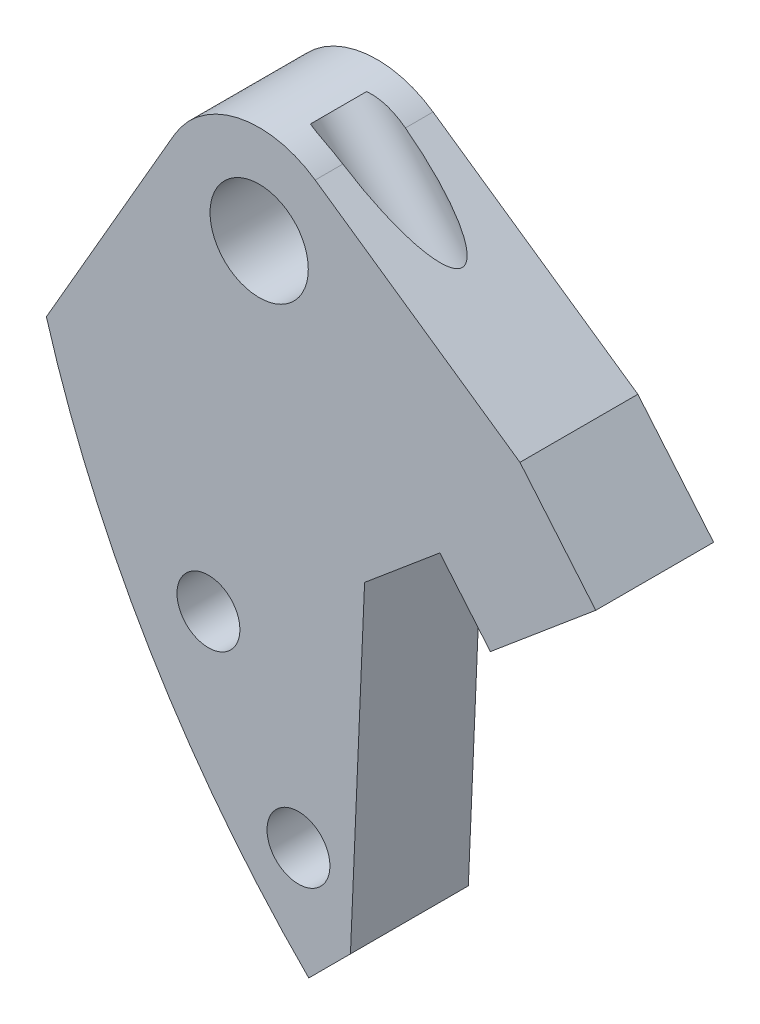
ISO-10303-21;
HEADER;
FILE_DESCRIPTION(('STEP AP214'),'2;1');
FILE_NAME('part.step','',(''),(''),'','','');
FILE_SCHEMA(('AUTOMOTIVE_DESIGN { 1 0 10303 214 1 1 1 1 }'));
ENDSEC;
DATA;
#1=APPLICATION_CONTEXT('core data for automotive mechanical design processes');
#2=APPLICATION_PROTOCOL_DEFINITION('international standard','automotive_design',2000,#1);
#3=PRODUCT_CONTEXT('',#1,'mechanical');
#4=PRODUCT('Part','Part','',(#3));
#5=PRODUCT_RELATED_PRODUCT_CATEGORY('part','',(#4));
#6=PRODUCT_DEFINITION_FORMATION('','',#4);
#7=PRODUCT_DEFINITION_CONTEXT('part definition',#1,'design');
#8=PRODUCT_DEFINITION('design','',#6,#7);
#9=PRODUCT_DEFINITION_SHAPE('','',#8);
#10=(LENGTH_UNIT() NAMED_UNIT(*) SI_UNIT(.MILLI.,.METRE.));
#11=(NAMED_UNIT(*) PLANE_ANGLE_UNIT() SI_UNIT($,.RADIAN.));
#12=(NAMED_UNIT(*) SI_UNIT($,.STERADIAN.) SOLID_ANGLE_UNIT());
#13=UNCERTAINTY_MEASURE_WITH_UNIT(LENGTH_MEASURE(1.E-05),#10,'distance_accuracy_value','');
#14=(GEOMETRIC_REPRESENTATION_CONTEXT(3) GLOBAL_UNCERTAINTY_ASSIGNED_CONTEXT((#13)) GLOBAL_UNIT_ASSIGNED_CONTEXT((#10,
#11,#12)) REPRESENTATION_CONTEXT('',''));
#15=CARTESIAN_POINT('',(0.,0.,0.));
#16=DIRECTION('',(0.,0.,1.));
#17=DIRECTION('',(1.,0.,0.));
#18=AXIS2_PLACEMENT_3D('',#15,#16,#17);
#19=CARTESIAN_POINT('',(7.91033905045424E-13,3.60822483003176E-13,6.));
#20=DIRECTION('',(0.,0.,-1.));
#21=DIRECTION('',(-1.,0.,0.));
#22=AXIS2_PLACEMENT_3D('',#19,#20,#21);
#23=PLANE('',#22);
#24=CARTESIAN_POINT('',(-42.5827835817611,-23.873668727191,6.));
#25=DIRECTION('',(0.,0.,-1.));
#26=DIRECTION('',(-1.,0.,0.));
#27=AXIS2_PLACEMENT_3D('',#24,#25,#26);
#28=CIRCLE('',#27,1.6);
#29=CARTESIAN_POINT('',(-44.1827835817612,-23.873668727191,6.));
#30=VERTEX_POINT('',#29);
#31=EDGE_CURVE('E306',#30,#30,#28,.T.);
#32=ORIENTED_EDGE('',*,*,#31,.T.);
#33=EDGE_LOOP('',(#32));
#34=FACE_BOUND('',#33,.T.);
#35=CARTESIAN_POINT('',(-38.,-32.,6.));
#36=DIRECTION('',(0.,0.,-1.));
#37=DIRECTION('',(-1.,0.,0.));
#38=AXIS2_PLACEMENT_3D('',#35,#36,#37);
#39=CIRCLE('',#38,1.6);
#40=CARTESIAN_POINT('',(-39.6,-32.,6.));
#41=VERTEX_POINT('',#40);
#42=EDGE_CURVE('E311',#41,#41,#39,.T.);
#43=ORIENTED_EDGE('',*,*,#42,.T.);
#44=EDGE_LOOP('',(#43));
#45=FACE_BOUND('',#44,.T.);
#46=CARTESIAN_POINT('',(7.91033905045424E-13,3.60822483003176E-13,6.));
#47=DIRECTION('',(0.,0.,1.));
#48=DIRECTION('',(-1.,0.,0.));
#49=AXIS2_PLACEMENT_3D('',#46,#47,#48);
#50=CIRCLE('',#49,53.0000000000019);
#51=CARTESIAN_POINT('',(-50.8304407825298,-15.0088737037077,6.));
#52=VERTEX_POINT('',#51);
#53=CARTESIAN_POINT('',(-37.4766594028879,-37.4766594028876,6.));
#54=VERTEX_POINT('',#53);
#55=EDGE_CURVE('E185',#52,#54,#50,.T.);
#56=ORIENTED_EDGE('',*,*,#55,.T.);
#57=DIRECTION('',(0.70710678118655,0.707106781186545,0.));
#58=VECTOR('',#57,1.);
#59=CARTESIAN_POINT('',(-37.4766594028879,-37.4766594028876,6.));
#60=LINE('',#59,#58);
#61=CARTESIAN_POINT('',(-35.3553390593275,-35.3553390593272,6.));
#62=VERTEX_POINT('',#61);
#63=EDGE_CURVE('E111',#54,#62,#60,.T.);
#64=ORIENTED_EDGE('',*,*,#63,.T.);
#65=DIRECTION('',(0.0429998145843386,0.99907508023457,0.));
#66=VECTOR('',#65,1.);
#67=CARTESIAN_POINT('',(-35.3553390593275,-35.3553390593272,6.));
#68=LINE('',#67,#66);
#69=CARTESIAN_POINT('',(-34.6350119375725,-18.6189674279805,6.));
#70=VERTEX_POINT('',#69);
#71=EDGE_CURVE('E283',#62,#70,#68,.T.);
#72=ORIENTED_EDGE('',*,*,#71,.T.);
#73=DIRECTION('',(0.766044443118976,0.642787609686541,0.));
#74=VECTOR('',#73,1.);
#75=CARTESIAN_POINT('',(-30.8047897219776,-15.4050293795478,6.));
#76=LINE('',#75,#74);
#77=CARTESIAN_POINT('',(-30.8047897219776,-15.4050293795478,6.));
#78=VERTEX_POINT('',#77);
#79=EDGE_CURVE('E295',#70,#78,#76,.T.);
#80=ORIENTED_EDGE('',*,*,#79,.T.);
#81=DIRECTION('',(0.642787609686543,-0.766044443118975,0.));
#82=VECTOR('',#81,1.);
#83=CARTESIAN_POINT('',(-28.2336392832319,-18.4692071520232,6.));
#84=LINE('',#83,#82);
#85=CARTESIAN_POINT('',(-28.2336392832319,-18.4692071520232,6.));
#86=VERTEX_POINT('',#85);
#87=EDGE_CURVE('E292',#78,#86,#84,.T.);
#88=ORIENTED_EDGE('',*,*,#87,.T.);
#89=DIRECTION('',(0.766044443118977,0.642787609686541,0.));
#90=VECTOR('',#89,1.);
#91=CARTESIAN_POINT('',(-22.871328181399,-13.9696938842174,6.));
#92=LINE('',#91,#90);
#93=CARTESIAN_POINT('',(-22.871328181399,-13.9696938842174,6.));
#94=VERTEX_POINT('',#93);
#95=EDGE_CURVE('E294',#86,#94,#92,.T.);
#96=ORIENTED_EDGE('',*,*,#95,.T.);
#97=DIRECTION('',(-0.642787609686539,0.766044443118978,0.));
#98=VECTOR('',#97,1.);
#99=CARTESIAN_POINT('',(-25.4424786201448,-10.905516111742,6.));
#100=LINE('',#99,#98);
#101=CARTESIAN_POINT('',(-26.7280538395179,-9.37342722550405,6.));
#102=VERTEX_POINT('',#101);
#103=EDGE_CURVE('E139',#94,#102,#100,.T.);
#104=ORIENTED_EDGE('',*,*,#103,.T.);
#105=DIRECTION('',(-0.821584560089023,0.570086669396266,0.));
#106=VECTOR('',#105,1.);
#107=CARTESIAN_POINT('',(-26.7280538395179,-9.37342722550405,6.));
#108=LINE('',#107,#106);
#109=CARTESIAN_POINT('',(-37.1495666530187,-2.14207719955489,6.));
#110=VERTEX_POINT('',#109);
#111=EDGE_CURVE('E132',#102,#110,#108,.T.);
#112=ORIENTED_EDGE('',*,*,#111,.T.);
#113=CARTESIAN_POINT('',(-40.,-6.25000000000001,6.));
#114=DIRECTION('',(0.,0.,1.));
#115=DIRECTION('',(1.,0.,0.));
#116=AXIS2_PLACEMENT_3D('',#113,#114,#115);
#117=CIRCLE('',#116,5.);
#118=CARTESIAN_POINT('',(-44.3301270189222,-3.75000000000002,6.));
#119=VERTEX_POINT('',#118);
#120=EDGE_CURVE('E136',#110,#119,#117,.T.);
#121=ORIENTED_EDGE('',*,*,#120,.T.);
#122=DIRECTION('',(-0.499999999999998,-0.86602540378444,0.));
#123=VECTOR('',#122,1.);
#124=CARTESIAN_POINT('',(-44.3301270189222,-3.75000000000002,6.));
#125=LINE('',#124,#123);
#126=EDGE_CURVE('E63',#119,#52,#125,.T.);
#127=ORIENTED_EDGE('',*,*,#126,.T.);
#128=EDGE_LOOP('',(#56,#64,#72,#80,#88,#96,#104,#112,#121,#127));
#129=FACE_BOUND('',#128,.T.);
#130=CARTESIAN_POINT('',(-40.,-6.25000000000001,6.));
#131=DIRECTION('',(0.,0.,1.));
#132=DIRECTION('',(1.,0.,0.));
#133=AXIS2_PLACEMENT_3D('',#130,#131,#132);
#134=CIRCLE('',#133,2.5);
#135=CARTESIAN_POINT('',(-37.5,-6.25000000000001,6.));
#136=VERTEX_POINT('',#135);
#137=EDGE_CURVE('E166',#136,#136,#134,.T.);
#138=ORIENTED_EDGE('',*,*,#137,.F.);
#139=EDGE_LOOP('',(#138));
#140=FACE_BOUND('',#139,.T.);
#141=ADVANCED_FACE('F34',(#34,#45,#129,#140),#23,.F.);
#142=CARTESIAN_POINT('',(7.91033905045424E-13,3.60822483003176E-13,0.));
#143=DIRECTION('',(0.,0.,-1.));
#144=DIRECTION('',(-1.,0.,0.));
#145=AXIS2_PLACEMENT_3D('',#142,#143,#144);
#146=PLANE('',#145);
#147=CARTESIAN_POINT('',(-42.5827835817611,-23.873668727191,0.));
#148=DIRECTION('',(0.,0.,-1.));
#149=DIRECTION('',(-1.,0.,0.));
#150=AXIS2_PLACEMENT_3D('',#147,#148,#149);
#151=CIRCLE('',#150,1.6);
#152=CARTESIAN_POINT('',(-44.1827835817612,-23.873668727191,0.));
#153=VERTEX_POINT('',#152);
#154=EDGE_CURVE('E314',#153,#153,#151,.T.);
#155=ORIENTED_EDGE('',*,*,#154,.F.);
#156=EDGE_LOOP('',(#155));
#157=FACE_BOUND('',#156,.T.);
#158=CARTESIAN_POINT('',(-38.,-32.,0.));
#159=DIRECTION('',(0.,0.,-1.));
#160=DIRECTION('',(-1.,0.,0.));
#161=AXIS2_PLACEMENT_3D('',#158,#159,#160);
#162=CIRCLE('',#161,1.6);
#163=CARTESIAN_POINT('',(-39.6,-32.,0.));
#164=VERTEX_POINT('',#163);
#165=EDGE_CURVE('E315',#164,#164,#162,.T.);
#166=ORIENTED_EDGE('',*,*,#165,.F.);
#167=EDGE_LOOP('',(#166));
#168=FACE_BOUND('',#167,.T.);
#169=CARTESIAN_POINT('',(7.91033905045424E-13,3.60822483003176E-13,0.));
#170=DIRECTION('',(0.,0.,1.));
#171=DIRECTION('',(-1.,0.,0.));
#172=AXIS2_PLACEMENT_3D('',#169,#170,#171);
#173=CIRCLE('',#172,53.0000000000019);
#174=CARTESIAN_POINT('',(-50.8304407825298,-15.0088737037077,0.));
#175=VERTEX_POINT('',#174);
#176=CARTESIAN_POINT('',(-37.4766594028879,-37.4766594028876,0.));
#177=VERTEX_POINT('',#176);
#178=EDGE_CURVE('E162',#175,#177,#173,.T.);
#179=ORIENTED_EDGE('',*,*,#178,.F.);
#180=DIRECTION('',(-0.499999999999998,-0.86602540378444,0.));
#181=VECTOR('',#180,1.);
#182=CARTESIAN_POINT('',(-44.3301270189222,-3.75000000000002,0.));
#183=LINE('',#182,#181);
#184=CARTESIAN_POINT('',(-44.3301270189222,-3.75000000000002,0.));
#185=VERTEX_POINT('',#184);
#186=EDGE_CURVE('E102',#185,#175,#183,.T.);
#187=ORIENTED_EDGE('',*,*,#186,.F.);
#188=CARTESIAN_POINT('',(-40.,-6.25000000000001,0.));
#189=DIRECTION('',(0.,0.,1.));
#190=DIRECTION('',(1.,0.,0.));
#191=AXIS2_PLACEMENT_3D('',#188,#189,#190);
#192=CIRCLE('',#191,5.);
#193=CARTESIAN_POINT('',(-37.1495666530187,-2.14207719955489,0.));
#194=VERTEX_POINT('',#193);
#195=EDGE_CURVE('E182',#194,#185,#192,.T.);
#196=ORIENTED_EDGE('',*,*,#195,.F.);
#197=DIRECTION('',(-0.821584560089023,0.570086669396266,0.));
#198=VECTOR('',#197,1.);
#199=CARTESIAN_POINT('',(-26.7280538395179,-9.37342722550405,0.));
#200=LINE('',#199,#198);
#201=CARTESIAN_POINT('',(-26.7280538395179,-9.37342722550405,0.));
#202=VERTEX_POINT('',#201);
#203=EDGE_CURVE('E179',#202,#194,#200,.T.);
#204=ORIENTED_EDGE('',*,*,#203,.F.);
#205=DIRECTION('',(-0.642787609686544,0.766044443118974,0.));
#206=VECTOR('',#205,1.);
#207=CARTESIAN_POINT('',(-25.4424786201448,-10.905516111742,0.));
#208=LINE('',#207,#206);
#209=CARTESIAN_POINT('',(-22.871328181399,-13.9696938842174,0.));
#210=VERTEX_POINT('',#209);
#211=EDGE_CURVE('E177',#210,#202,#208,.T.);
#212=ORIENTED_EDGE('',*,*,#211,.F.);
#213=DIRECTION('',(0.766044443118977,0.642787609686541,0.));
#214=VECTOR('',#213,1.);
#215=CARTESIAN_POINT('',(-22.871328181399,-13.9696938842174,0.));
#216=LINE('',#215,#214);
#217=CARTESIAN_POINT('',(-28.2336392832319,-18.4692071520232,0.));
#218=VERTEX_POINT('',#217);
#219=EDGE_CURVE('E174',#218,#210,#216,.T.);
#220=ORIENTED_EDGE('',*,*,#219,.F.);
#221=DIRECTION('',(0.642787609686543,-0.766044443118975,0.));
#222=VECTOR('',#221,1.);
#223=CARTESIAN_POINT('',(-28.2336392832319,-18.4692071520232,0.));
#224=LINE('',#223,#222);
#225=CARTESIAN_POINT('',(-30.8047897219776,-15.4050293795478,0.));
#226=VERTEX_POINT('',#225);
#227=EDGE_CURVE('E172',#226,#218,#224,.T.);
#228=ORIENTED_EDGE('',*,*,#227,.F.);
#229=DIRECTION('',(0.766044443118976,0.642787609686541,0.));
#230=VECTOR('',#229,1.);
#231=CARTESIAN_POINT('',(-30.8047897219776,-15.4050293795478,0.));
#232=LINE('',#231,#230);
#233=CARTESIAN_POINT('',(-34.6350119375725,-18.6189674279805,0.));
#234=VERTEX_POINT('',#233);
#235=EDGE_CURVE('E170',#234,#226,#232,.T.);
#236=ORIENTED_EDGE('',*,*,#235,.F.);
#237=DIRECTION('',(0.0429998145843386,0.99907508023457,0.));
#238=VECTOR('',#237,1.);
#239=CARTESIAN_POINT('',(-35.3553390593275,-35.3553390593272,0.));
#240=LINE('',#239,#238);
#241=CARTESIAN_POINT('',(-35.3553390593275,-35.3553390593272,0.));
#242=VERTEX_POINT('',#241);
#243=EDGE_CURVE('E168',#242,#234,#240,.T.);
#244=ORIENTED_EDGE('',*,*,#243,.F.);
#245=DIRECTION('',(0.70710678118655,0.707106781186545,0.));
#246=VECTOR('',#245,1.);
#247=CARTESIAN_POINT('',(-37.4766594028879,-37.4766594028876,0.));
#248=LINE('',#247,#246);
#249=EDGE_CURVE('E165',#177,#242,#248,.T.);
#250=ORIENTED_EDGE('',*,*,#249,.F.);
#251=EDGE_LOOP('',(#179,#187,#196,#204,#212,#220,#228,#236,#244,#250));
#252=FACE_BOUND('',#251,.T.);
#253=CARTESIAN_POINT('',(-40.,-6.25000000000001,0.));
#254=DIRECTION('',(0.,0.,1.));
#255=DIRECTION('',(1.,0.,0.));
#256=AXIS2_PLACEMENT_3D('',#253,#254,#255);
#257=CIRCLE('',#256,2.5);
#258=CARTESIAN_POINT('',(-37.5,-6.25000000000001,0.));
#259=VERTEX_POINT('',#258);
#260=EDGE_CURVE('E303',#259,#259,#257,.T.);
#261=ORIENTED_EDGE('',*,*,#260,.T.);
#262=EDGE_LOOP('',(#261));
#263=FACE_BOUND('',#262,.T.);
#264=ADVANCED_FACE('F238',(#157,#168,#252,#263),#146,.T.);
#265=CARTESIAN_POINT('',(7.91033905045424E-13,3.60822483003176E-13,6.));
#266=DIRECTION('',(0.,0.,-1.));
#267=DIRECTION('',(-1.,0.,0.));
#268=AXIS2_PLACEMENT_3D('',#265,#266,#267);
#269=CYLINDRICAL_SURFACE('',#268,53.0000000000019);
#270=ORIENTED_EDGE('',*,*,#178,.T.);
#271=DIRECTION('',(0.,0.,-1.));
#272=VECTOR('',#271,1.);
#273=CARTESIAN_POINT('',(-37.4766594028879,-37.4766594028876,6.));
#274=LINE('',#273,#272);
#275=EDGE_CURVE('E204',#54,#177,#274,.T.);
#276=ORIENTED_EDGE('',*,*,#275,.F.);
#277=ORIENTED_EDGE('',*,*,#55,.F.);
#278=DIRECTION('',(0.,0.,-1.));
#279=VECTOR('',#278,1.);
#280=CARTESIAN_POINT('',(-50.8304407825298,-15.0088737037077,6.));
#281=LINE('',#280,#279);
#282=EDGE_CURVE('E158',#52,#175,#281,.T.);
#283=ORIENTED_EDGE('',*,*,#282,.T.);
#284=EDGE_LOOP('',(#270,#276,#277,#283));
#285=FACE_BOUND('',#284,.T.);
#286=ADVANCED_FACE('F36',(#285),#269,.T.);
#287=CARTESIAN_POINT('',(-37.4766594028879,-37.4766594028876,6.));
#288=DIRECTION('',(-0.707106781186545,0.70710678118655,0.));
#289=DIRECTION('',(-0.70710678118655,-0.707106781186545,0.));
#290=AXIS2_PLACEMENT_3D('',#287,#288,#289);
#291=PLANE('',#290);
#292=ORIENTED_EDGE('',*,*,#249,.T.);
#293=DIRECTION('',(0.,0.,-1.));
#294=VECTOR('',#293,1.);
#295=CARTESIAN_POINT('',(-35.3553390593275,-35.3553390593272,6.));
#296=LINE('',#295,#294);
#297=EDGE_CURVE('E201',#62,#242,#296,.T.);
#298=ORIENTED_EDGE('',*,*,#297,.F.);
#299=ORIENTED_EDGE('',*,*,#63,.F.);
#300=ORIENTED_EDGE('',*,*,#275,.T.);
#301=EDGE_LOOP('',(#292,#298,#299,#300));
#302=FACE_BOUND('',#301,.T.);
#303=ADVANCED_FACE('F270',(#302),#291,.F.);
#304=CARTESIAN_POINT('',(-35.3553390593275,-35.3553390593272,6.));
#305=DIRECTION('',(-0.99907508023457,0.0429998145843386,0.));
#306=DIRECTION('',(-0.0429998145843386,-0.99907508023457,0.));
#307=AXIS2_PLACEMENT_3D('',#304,#305,#306);
#308=PLANE('',#307);
#309=ORIENTED_EDGE('',*,*,#243,.T.);
#310=DIRECTION('',(0.,0.,-1.));
#311=VECTOR('',#310,1.);
#312=CARTESIAN_POINT('',(-34.6350119375725,-18.6189674279805,6.));
#313=LINE('',#312,#311);
#314=EDGE_CURVE('E198',#70,#234,#313,.T.);
#315=ORIENTED_EDGE('',*,*,#314,.F.);
#316=ORIENTED_EDGE('',*,*,#71,.F.);
#317=ORIENTED_EDGE('',*,*,#297,.T.);
#318=EDGE_LOOP('',(#309,#315,#316,#317));
#319=FACE_BOUND('',#318,.T.);
#320=ADVANCED_FACE('F267',(#319),#308,.F.);
#321=CARTESIAN_POINT('',(-30.8047897219776,-15.4050293795478,6.));
#322=DIRECTION('',(-0.642787609686542,0.766044443118976,0.));
#323=DIRECTION('',(-0.766044443118976,-0.642787609686542,0.));
#324=AXIS2_PLACEMENT_3D('',#321,#322,#323);
#325=PLANE('',#324);
#326=ORIENTED_EDGE('',*,*,#235,.T.);
#327=DIRECTION('',(0.,0.,-1.));
#328=VECTOR('',#327,1.);
#329=CARTESIAN_POINT('',(-30.8047897219776,-15.4050293795478,6.));
#330=LINE('',#329,#328);
#331=EDGE_CURVE('E195',#78,#226,#330,.T.);
#332=ORIENTED_EDGE('',*,*,#331,.F.);
#333=ORIENTED_EDGE('',*,*,#79,.F.);
#334=ORIENTED_EDGE('',*,*,#314,.T.);
#335=EDGE_LOOP('',(#326,#332,#333,#334));
#336=FACE_BOUND('',#335,.T.);
#337=ADVANCED_FACE('F263',(#336),#325,.F.);
#338=CARTESIAN_POINT('',(-28.2336392832319,-18.4692071520232,6.));
#339=DIRECTION('',(0.766044443118975,0.642787609686543,0.));
#340=DIRECTION('',(-0.642787609686543,0.766044443118975,0.));
#341=AXIS2_PLACEMENT_3D('',#338,#339,#340);
#342=PLANE('',#341);
#343=ORIENTED_EDGE('',*,*,#227,.T.);
#344=DIRECTION('',(0.,0.,-1.));
#345=VECTOR('',#344,1.);
#346=CARTESIAN_POINT('',(-28.2336392832319,-18.4692071520232,6.));
#347=LINE('',#346,#345);
#348=EDGE_CURVE('E192',#86,#218,#347,.T.);
#349=ORIENTED_EDGE('',*,*,#348,.F.);
#350=ORIENTED_EDGE('',*,*,#87,.F.);
#351=ORIENTED_EDGE('',*,*,#331,.T.);
#352=EDGE_LOOP('',(#343,#349,#350,#351));
#353=FACE_BOUND('',#352,.T.);
#354=ADVANCED_FACE('F259',(#353),#342,.F.);
#355=CARTESIAN_POINT('',(-22.871328181399,-13.9696938842174,6.));
#356=DIRECTION('',(-0.642787609686541,0.766044443118976,0.));
#357=DIRECTION('',(-0.766044443118977,-0.642787609686541,0.));
#358=AXIS2_PLACEMENT_3D('',#355,#356,#357);
#359=PLANE('',#358);
#360=CARTESIAN_POINT('',(-25.5524837323155,-16.2194505181203,3.));
#361=DIRECTION('',(0.642787609686541,-0.766044443118977,0.));
#362=DIRECTION('',(0.766044443118977,0.642787609686541,0.));
#363=AXIS2_PLACEMENT_3D('',#360,#361,#362);
#364=CIRCLE('',#363,1.6);
#365=CARTESIAN_POINT('',(-24.3268126233251,-15.1909903426219,3.));
#366=VERTEX_POINT('',#365);
#367=EDGE_CURVE('E321',#366,#366,#364,.T.);
#368=ORIENTED_EDGE('',*,*,#367,.F.);
#369=EDGE_LOOP('',(#368));
#370=FACE_BOUND('',#369,.T.);
#371=ORIENTED_EDGE('',*,*,#219,.T.);
#372=DIRECTION('',(0.,0.,-1.));
#373=VECTOR('',#372,1.);
#374=CARTESIAN_POINT('',(-22.871328181399,-13.9696938842174,6.));
#375=LINE('',#374,#373);
#376=EDGE_CURVE('E189',#94,#210,#375,.T.);
#377=ORIENTED_EDGE('',*,*,#376,.F.);
#378=ORIENTED_EDGE('',*,*,#95,.F.);
#379=ORIENTED_EDGE('',*,*,#348,.T.);
#380=EDGE_LOOP('',(#371,#377,#378,#379));
#381=FACE_BOUND('',#380,.T.);
#382=ADVANCED_FACE('F253',(#370,#381),#359,.F.);
#383=CARTESIAN_POINT('',(-25.4424786201448,-10.905516111742,6.));
#384=DIRECTION('',(-0.766044443118974,-0.642787609686544,0.));
#385=DIRECTION('',(0.642787609686544,-0.766044443118974,0.));
#386=AXIS2_PLACEMENT_3D('',#383,#384,#385);
#387=PLANE('',#386);
#388=ORIENTED_EDGE('',*,*,#211,.T.);
#389=DIRECTION('',(0.,0.,-1.));
#390=VECTOR('',#389,1.);
#391=CARTESIAN_POINT('',(-26.7280538395179,-9.37342722550405,6.));
#392=LINE('',#391,#390);
#393=EDGE_CURVE('E152',#102,#202,#392,.T.);
#394=ORIENTED_EDGE('',*,*,#393,.F.);
#395=ORIENTED_EDGE('',*,*,#103,.F.);
#396=ORIENTED_EDGE('',*,*,#376,.T.);
#397=EDGE_LOOP('',(#388,#394,#395,#396));
#398=FACE_BOUND('',#397,.T.);
#399=ADVANCED_FACE('F249',(#398),#387,.F.);
#400=CARTESIAN_POINT('',(-26.7280538395179,-9.37342722550405,6.));
#401=DIRECTION('',(-0.570086669396266,-0.821584560089023,0.));
#402=DIRECTION('',(0.821584560089023,-0.570086669396266,0.));
#403=AXIS2_PLACEMENT_3D('',#400,#401,#402);
#404=PLANE('',#403);
#405=DIRECTION('',(0.,0.,-1.));
#406=VECTOR('',#405,1.);
#407=CARTESIAN_POINT('',(-37.1495666530187,-2.14207719955489,6.));
#408=LINE('',#407,#406);
#409=CARTESIAN_POINT('',(-37.1495666530187,-2.14207719955489,1.4085181390887));
#410=VERTEX_POINT('',#409);
#411=EDGE_CURVE('E153',#410,#194,#408,.T.);
#412=ORIENTED_EDGE('',*,*,#411,.F.);
#413=CARTESIAN_POINT('',(-37.6647809242589,-1.78457682505304,3.));
#414=DIRECTION('',(-0.570086669396266,-0.821584560089023,0.));
#415=DIRECTION('',(0.821584560089023,-0.570086669396266,0.));
#416=AXIS2_PLACEMENT_3D('',#413,#414,#415);
#417=ELLIPSE('',#416,6.08537077031782,1.6);
#418=CARTESIAN_POINT('',(-37.1495666530187,-2.14207719955489,4.5914818609113));
#419=VERTEX_POINT('',#418);
#420=EDGE_CURVE('E150',#410,#419,#417,.T.);
#421=ORIENTED_EDGE('',*,*,#420,.T.);
#422=EDGE_CURVE('E146',#110,#419,#408,.T.);
#423=ORIENTED_EDGE('',*,*,#422,.F.);
#424=ORIENTED_EDGE('',*,*,#111,.F.);
#425=ORIENTED_EDGE('',*,*,#393,.T.);
#426=ORIENTED_EDGE('',*,*,#203,.T.);
#427=EDGE_LOOP('',(#412,#421,#423,#424,#425,#426));
#428=FACE_BOUND('',#427,.T.);
#429=ADVANCED_FACE('F148',(#428),#404,.F.);
#430=CARTESIAN_POINT('',(-40.,-6.25000000000001,6.));
#431=DIRECTION('',(0.,0.,-1.));
#432=DIRECTION('',(-1.,0.,0.));
#433=AXIS2_PLACEMENT_3D('',#430,#431,#432);
#434=CYLINDRICAL_SURFACE('',#433,5.);
#435=ORIENTED_EDGE('',*,*,#422,.T.);
#436=CARTESIAN_POINT('',(-37.1495666530187,-2.14207719955489,4.5914818609113));
#437=CARTESIAN_POINT('',(-37.2048349159681,-2.10372793197456,4.5933098926173));
#438=CARTESIAN_POINT('',(-37.2608735092874,-2.06649567905156,4.59498479047128));
#439=CARTESIAN_POINT('',(-37.3744297592647,-1.99430832955196,4.59772999468321));
#440=CARTESIAN_POINT('',(-37.4319477363269,-1.95935373216046,4.59880016889784));
#441=CARTESIAN_POINT('',(-37.6071164768655,-1.85769091144779,4.60066030344035));
#442=CARTESIAN_POINT('',(-37.7268823077363,-1.79453055282274,4.600077962291));
#443=CARTESIAN_POINT('',(-37.967275416645,-1.67996454689824,4.5924573790444));
#444=CARTESIAN_POINT('',(-38.0877661279141,-1.62826022238123,4.58561569203603));
#445=CARTESIAN_POINT('',(-38.331459618452,-1.53482079523253,4.56253518866294));
#446=CARTESIAN_POINT('',(-38.4546545734572,-1.49306024316524,4.54632073341238));
#447=CARTESIAN_POINT('',(-38.6413465525952,-1.43768052521554,4.51185691390897));
#448=CARTESIAN_POINT('',(-38.704631178381,-1.42027481540997,4.49846398084329));
#449=CARTESIAN_POINT('',(-38.8313794197268,-1.3880402564461,4.46753772900614));
#450=CARTESIAN_POINT('',(-38.8948407295871,-1.37323203558293,4.44997366312796));
#451=CARTESIAN_POINT('',(-38.9579174220258,-1.35979919628217,4.43007348908128));
#452=B_SPLINE_CURVE_WITH_KNOTS('',3,(#436,#437,#438,#439,#440,#441,#442,#443,#444,#445,#446,
#447,#448,#449,#450,#451),.UNSPECIFIED.,.F.,.F.,(4,2,2,2,2,2,2,4),(0.,0.201853201089735,
0.403750493804115,0.80936559982959,1.20266515803208,1.59494704379695,1.7957509986066,
1.99808380527076),.UNSPECIFIED.);
#453=CARTESIAN_POINT('',(-38.9579174220258,-1.35979919628217,4.43007348908127));
#454=VERTEX_POINT('',#453);
#455=EDGE_CURVE('E11',#419,#454,#452,.T.);
#456=ORIENTED_EDGE('',*,*,#455,.T.);
#457=DIRECTION('',(0.,0.,-1.));
#458=VECTOR('',#457,1.);
#459=CARTESIAN_POINT('',(-38.9579174220258,-1.35979919628217,6.));
#460=LINE('',#459,#458);
#461=CARTESIAN_POINT('',(-38.9579174220258,-1.35979919628217,1.56992651091873));
#462=VERTEX_POINT('',#461);
#463=EDGE_CURVE('E206',#462,#454,#460,.F.);
#464=ORIENTED_EDGE('',*,*,#463,.F.);
#465=CARTESIAN_POINT('',(-38.9579174220258,-1.35979919628217,1.56992651091872));
#466=CARTESIAN_POINT('',(-38.8768670960438,-1.37704251013018,1.54437404089471));
#467=CARTESIAN_POINT('',(-38.7952119365731,-1.39657579569132,1.52265853724896));
#468=CARTESIAN_POINT('',(-38.6317959936908,-1.44010633905259,1.48573639509054));
#469=CARTESIAN_POINT('',(-38.5500357926345,-1.46409413185247,1.47051617735015));
#470=CARTESIAN_POINT('',(-38.3884672697076,-1.51607196664862,1.44552367807907));
#471=CARTESIAN_POINT('',(-38.3086486393605,-1.54399189664635,1.4356681934135));
#472=CARTESIAN_POINT('',(-38.1501569808116,-1.60400605239458,1.4200094249066));
#473=CARTESIAN_POINT('',(-38.0714845533842,-1.63610238543256,1.41420819619922));
#474=CARTESIAN_POINT('',(-37.9203208594602,-1.70232566497772,1.40599248252139));
#475=CARTESIAN_POINT('',(-37.8477378049836,-1.736222886207,1.40339921560928));
#476=CARTESIAN_POINT('',(-37.7042618498568,-1.80747804947293,1.4003103188565));
#477=CARTESIAN_POINT('',(-37.6333687299439,-1.84483553944562,1.39981441540141));
#478=CARTESIAN_POINT('',(-37.4923796348181,-1.9235167046951,1.40030881226637));
#479=CARTESIAN_POINT('',(-37.4223131912104,-1.96489301529323,1.40132233990005));
#480=CARTESIAN_POINT('',(-37.2843059747338,-2.05099717021611,1.40432594582466));
#481=CARTESIAN_POINT('',(-37.2163648788723,-2.09572450173854,1.40631587495575));
#482=CARTESIAN_POINT('',(-37.1495666530187,-2.14207719955489,1.4085181390887));
#483=B_SPLINE_CURVE_WITH_KNOTS('',3,(#465,#466,#467,#468,#469,#470,#471,#472,#473,#474,#475,
#476,#477,#478,#479,#480,#481,#482),.UNSPECIFIED.,.F.,.F.,(4,2,2,2,2,2,2,2,4),(0.,
0.259870425803457,0.519194865515395,0.774373640891333,1.02968167473863,1.27000602188992,
1.51029901623153,1.75432807604351,1.99831986838634),.UNSPECIFIED.);
#484=EDGE_CURVE('E48',#462,#410,#483,.T.);
#485=ORIENTED_EDGE('',*,*,#484,.T.);
#486=ORIENTED_EDGE('',*,*,#411,.T.);
#487=ORIENTED_EDGE('',*,*,#195,.T.);
#488=DIRECTION('',(0.,0.,-1.));
#489=VECTOR('',#488,1.);
#490=CARTESIAN_POINT('',(-44.3301270189222,-3.75000000000002,6.));
#491=LINE('',#490,#489);
#492=EDGE_CURVE('E156',#119,#185,#491,.T.);
#493=ORIENTED_EDGE('',*,*,#492,.F.);
#494=ORIENTED_EDGE('',*,*,#120,.F.);
#495=EDGE_LOOP('',(#435,#456,#464,#485,#486,#487,#493,#494));
#496=FACE_BOUND('',#495,.T.);
#497=ADVANCED_FACE('F155',(#496),#434,.T.);
#498=CARTESIAN_POINT('',(-44.3301270189222,-3.75000000000002,6.));
#499=DIRECTION('',(0.86602540378444,-0.499999999999998,0.));
#500=DIRECTION('',(0.499999999999998,0.86602540378444,0.));
#501=AXIS2_PLACEMENT_3D('',#498,#499,#500);
#502=PLANE('',#501);
#503=ORIENTED_EDGE('',*,*,#186,.T.);
#504=ORIENTED_EDGE('',*,*,#282,.F.);
#505=ORIENTED_EDGE('',*,*,#126,.F.);
#506=ORIENTED_EDGE('',*,*,#492,.T.);
#507=EDGE_LOOP('',(#503,#504,#505,#506));
#508=FACE_BOUND('',#507,.T.);
#509=ADVANCED_FACE('F234',(#508),#502,.F.);
#510=CARTESIAN_POINT('',(-40.,-6.25000000000001,6.));
#511=DIRECTION('',(0.,0.,-1.));
#512=DIRECTION('',(-1.,0.,0.));
#513=AXIS2_PLACEMENT_3D('',#510,#511,#512);
#514=CYLINDRICAL_SURFACE('',#513,2.5);
#515=ORIENTED_EDGE('',*,*,#137,.T.);
#516=EDGE_LOOP('',(#515));
#517=FACE_BOUND('',#516,.T.);
#518=ORIENTED_EDGE('',*,*,#260,.F.);
#519=EDGE_LOOP('',(#518));
#520=FACE_BOUND('',#519,.T.);
#521=ADVANCED_FACE('F230',(#517,#520),#514,.F.);
#522=CARTESIAN_POINT('',(-38.,-32.,10.));
#523=DIRECTION('',(0.,0.,-1.));
#524=DIRECTION('',(-1.,0.,0.));
#525=AXIS2_PLACEMENT_3D('',#522,#523,#524);
#526=CYLINDRICAL_SURFACE('',#525,1.6);
#527=ORIENTED_EDGE('',*,*,#165,.T.);
#528=EDGE_LOOP('',(#527));
#529=FACE_BOUND('',#528,.T.);
#530=ORIENTED_EDGE('',*,*,#42,.F.);
#531=EDGE_LOOP('',(#530));
#532=FACE_BOUND('',#531,.T.);
#533=ADVANCED_FACE('F226',(#529,#532),#526,.F.);
#534=CARTESIAN_POINT('',(-42.5827835817611,-23.873668727191,10.));
#535=DIRECTION('',(0.,0.,-1.));
#536=DIRECTION('',(-1.,0.,0.));
#537=AXIS2_PLACEMENT_3D('',#534,#535,#536);
#538=CYLINDRICAL_SURFACE('',#537,1.6);
#539=ORIENTED_EDGE('',*,*,#154,.T.);
#540=EDGE_LOOP('',(#539));
#541=FACE_BOUND('',#540,.T.);
#542=ORIENTED_EDGE('',*,*,#31,.F.);
#543=EDGE_LOOP('',(#542));
#544=FACE_BOUND('',#543,.T.);
#545=ADVANCED_FACE('F221',(#541,#544),#538,.F.);
#546=CARTESIAN_POINT('',(-38.4082359260463,-0.898561655740791,3.));
#547=DIRECTION('',(0.642787609686541,-0.766044443118977,0.));
#548=DIRECTION('',(0.766044443118977,0.642787609686541,0.));
#549=AXIS2_PLACEMENT_3D('',#546,#547,#548);
#550=CYLINDRICAL_SURFACE('',#549,1.6);
#551=ORIENTED_EDGE('',*,*,#367,.T.);
#552=EDGE_LOOP('',(#551));
#553=FACE_BOUND('',#552,.T.);
#554=ORIENTED_EDGE('',*,*,#420,.F.);
#555=ORIENTED_EDGE('',*,*,#484,.F.);
#556=CARTESIAN_POINT('',(-38.4082359260463,-0.898561655740791,3.));
#557=DIRECTION('',(0.642787609686541,-0.766044443118977,0.));
#558=DIRECTION('',(0.766044443118977,0.642787609686541,0.));
#559=AXIS2_PLACEMENT_3D('',#556,#557,#558);
#560=CIRCLE('',#559,1.6);
#561=EDGE_CURVE('E54',#454,#462,#560,.T.);
#562=ORIENTED_EDGE('',*,*,#561,.F.);
#563=ORIENTED_EDGE('',*,*,#455,.F.);
#564=EDGE_LOOP('',(#554,#555,#562,#563));
#565=FACE_BOUND('',#564,.T.);
#566=ADVANCED_FACE('F215',(#553,#565),#550,.F.);
#567=CARTESIAN_POINT('',(-38.4082359260463,-0.898561655740791,3.));
#568=DIRECTION('',(0.642787609686541,-0.766044443118977,0.));
#569=DIRECTION('',(0.766044443118977,0.642787609686541,0.));
#570=AXIS2_PLACEMENT_3D('',#567,#568,#569);
#571=PLANE('',#570);
#572=ORIENTED_EDGE('',*,*,#463,.T.);
#573=ORIENTED_EDGE('',*,*,#561,.T.);
#574=EDGE_LOOP('',(#572,#573));
#575=FACE_BOUND('',#574,.T.);
#576=ADVANCED_FACE('F220',(#575),#571,.T.);
#577=CLOSED_SHELL('',(#141,#264,#286,#303,#320,#337,#354,#382,#399,#429,#497,#509,#521,#533,
#545,#566,#576));
#578=MANIFOLD_SOLID_BREP('B2',#577);
#579=ADVANCED_BREP_SHAPE_REPRESENTATION('',(#18,#578),#14);
#580=SHAPE_DEFINITION_REPRESENTATION(#9,#579);
ENDSEC;
END-ISO-10303-21;
